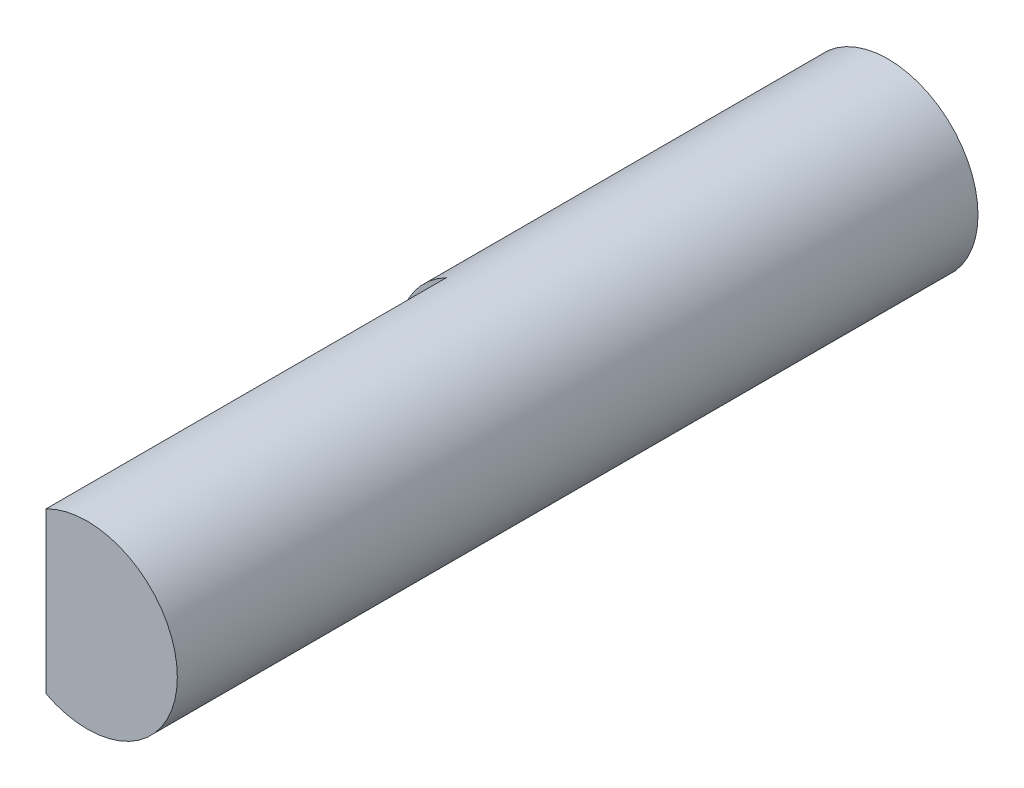
ISO-10303-21;
HEADER;
FILE_DESCRIPTION(('STEP AP214'),'2;1');
FILE_NAME('part.step','',(''),(''),'','','');
FILE_SCHEMA(('AUTOMOTIVE_DESIGN { 1 0 10303 214 1 1 1 1 }'));
ENDSEC;
DATA;
#1=APPLICATION_CONTEXT('core data for automotive mechanical design processes');
#2=APPLICATION_PROTOCOL_DEFINITION('international standard','automotive_design',2000,#1);
#3=PRODUCT_CONTEXT('',#1,'mechanical');
#4=PRODUCT('Part','Part','',(#3));
#5=PRODUCT_RELATED_PRODUCT_CATEGORY('part','',(#4));
#6=PRODUCT_DEFINITION_FORMATION('','',#4);
#7=PRODUCT_DEFINITION_CONTEXT('part definition',#1,'design');
#8=PRODUCT_DEFINITION('design','',#6,#7);
#9=PRODUCT_DEFINITION_SHAPE('','',#8);
#10=(LENGTH_UNIT() NAMED_UNIT(*) SI_UNIT(.MILLI.,.METRE.));
#11=(NAMED_UNIT(*) PLANE_ANGLE_UNIT() SI_UNIT($,.RADIAN.));
#12=(NAMED_UNIT(*) SI_UNIT($,.STERADIAN.) SOLID_ANGLE_UNIT());
#13=UNCERTAINTY_MEASURE_WITH_UNIT(LENGTH_MEASURE(1.E-05),#10,'distance_accuracy_value','');
#14=(GEOMETRIC_REPRESENTATION_CONTEXT(3) GLOBAL_UNCERTAINTY_ASSIGNED_CONTEXT((#13)) GLOBAL_UNIT_ASSIGNED_CONTEXT((#10,
#11,#12)) REPRESENTATION_CONTEXT('',''));
#15=CARTESIAN_POINT('',(0.,0.,0.));
#16=DIRECTION('',(0.,0.,1.));
#17=DIRECTION('',(1.,0.,0.));
#18=AXIS2_PLACEMENT_3D('',#15,#16,#17);
#19=CARTESIAN_POINT('',(-10.3077640640441,0.,150.));
#20=DIRECTION('',(1.,0.,0.));
#21=DIRECTION('',(0.,0.,-1.));
#22=AXIS2_PLACEMENT_3D('',#19,#20,#21);
#23=PLANE('',#22);
#24=DIRECTION('',(0.,0.,-1.));
#25=VECTOR('',#24,1.);
#26=CARTESIAN_POINT('',(-10.3077640640441,20.,150.));
#27=LINE('',#26,#25);
#28=CARTESIAN_POINT('',(-10.3077640640442,20.,200.));
#29=VERTEX_POINT('',#28);
#30=CARTESIAN_POINT('',(-10.3077640640441,20.,100.));
#31=VERTEX_POINT('',#30);
#32=EDGE_CURVE('E90',#29,#31,#27,.T.);
#33=ORIENTED_EDGE('',*,*,#32,.T.);
#34=DIRECTION('',(0.,-1.,0.));
#35=VECTOR('',#34,1.);
#36=CARTESIAN_POINT('',(-10.3077640640441,0.,100.));
#37=LINE('',#36,#35);
#38=CARTESIAN_POINT('',(-10.3077640640441,-20.,100.));
#39=VERTEX_POINT('',#38);
#40=EDGE_CURVE('E85',#31,#39,#37,.T.);
#41=ORIENTED_EDGE('',*,*,#40,.T.);
#42=DIRECTION('',(0.,0.,-1.));
#43=VECTOR('',#42,1.);
#44=CARTESIAN_POINT('',(-10.3077640640441,-20.,150.));
#45=LINE('',#44,#43);
#46=CARTESIAN_POINT('',(-10.3077640640442,-20.,200.));
#47=VERTEX_POINT('',#46);
#48=EDGE_CURVE('E104',#47,#39,#45,.T.);
#49=ORIENTED_EDGE('',*,*,#48,.F.);
#50=DIRECTION('',(0.,-1.,0.));
#51=VECTOR('',#50,1.);
#52=CARTESIAN_POINT('',(-10.3077640640441,0.,200.));
#53=LINE('',#52,#51);
#54=EDGE_CURVE('E108',#29,#47,#53,.T.);
#55=ORIENTED_EDGE('',*,*,#54,.F.);
#56=EDGE_LOOP('',(#33,#41,#49,#55));
#57=FACE_BOUND('',#56,.T.);
#58=ADVANCED_FACE('F44',(#57),#23,.F.);
#59=CARTESIAN_POINT('',(0.,0.,150.));
#60=DIRECTION('',(0.,0.,-1.));
#61=DIRECTION('',(-1.,0.,0.));
#62=AXIS2_PLACEMENT_3D('',#59,#60,#61);
#63=CYLINDRICAL_SURFACE('',#62,22.5);
#64=ORIENTED_EDGE('',*,*,#48,.T.);
#65=CARTESIAN_POINT('',(0.,0.,100.));
#66=DIRECTION('',(0.,0.,1.));
#67=DIRECTION('',(1.,0.,0.));
#68=AXIS2_PLACEMENT_3D('',#65,#66,#67);
#69=CIRCLE('',#68,22.5);
#70=EDGE_CURVE('E102',#31,#39,#69,.T.);
#71=ORIENTED_EDGE('',*,*,#70,.F.);
#72=ORIENTED_EDGE('',*,*,#32,.F.);
#73=CARTESIAN_POINT('',(0.,0.,200.));
#74=DIRECTION('',(0.,0.,1.));
#75=DIRECTION('',(1.,0.,0.));
#76=AXIS2_PLACEMENT_3D('',#73,#74,#75);
#77=CIRCLE('',#76,22.5);
#78=EDGE_CURVE('E100',#47,#29,#77,.T.);
#79=ORIENTED_EDGE('',*,*,#78,.F.);
#80=EDGE_LOOP('',(#64,#71,#72,#79));
#81=FACE_BOUND('',#80,.T.);
#82=CARTESIAN_POINT('',(0.,0.,0.));
#83=DIRECTION('',(0.,0.,1.));
#84=DIRECTION('',(1.,0.,0.));
#85=AXIS2_PLACEMENT_3D('',#82,#83,#84);
#86=CIRCLE('',#85,22.5);
#87=CARTESIAN_POINT('',(22.5,0.,0.));
#88=VERTEX_POINT('',#87);
#89=EDGE_CURVE('E105',#88,#88,#86,.T.);
#90=ORIENTED_EDGE('',*,*,#89,.T.);
#91=EDGE_LOOP('',(#90));
#92=FACE_BOUND('',#91,.T.);
#93=ADVANCED_FACE('F97',(#81,#92),#63,.T.);
#94=CARTESIAN_POINT('',(0.,0.,0.));
#95=DIRECTION('',(0.,0.,1.));
#96=DIRECTION('',(1.,0.,0.));
#97=AXIS2_PLACEMENT_3D('',#94,#95,#96);
#98=PLANE('',#97);
#99=ORIENTED_EDGE('',*,*,#89,.F.);
#100=EDGE_LOOP('',(#99));
#101=FACE_BOUND('',#100,.T.);
#102=ADVANCED_FACE('F165',(#101),#98,.F.);
#103=CARTESIAN_POINT('',(0.,0.,100.));
#104=DIRECTION('',(0.,0.,1.));
#105=DIRECTION('',(1.,0.,0.));
#106=AXIS2_PLACEMENT_3D('',#103,#104,#105);
#107=PLANE('',#106);
#108=ORIENTED_EDGE('',*,*,#40,.F.);
#109=ORIENTED_EDGE('',*,*,#70,.T.);
#110=EDGE_LOOP('',(#108,#109));
#111=FACE_BOUND('',#110,.T.);
#112=ADVANCED_FACE('F168',(#111),#107,.T.);
#113=CARTESIAN_POINT('',(0.,0.,200.));
#114=DIRECTION('',(0.,0.,1.));
#115=DIRECTION('',(1.,0.,0.));
#116=AXIS2_PLACEMENT_3D('',#113,#114,#115);
#117=PLANE('',#116);
#118=ORIENTED_EDGE('',*,*,#78,.T.);
#119=ORIENTED_EDGE('',*,*,#54,.T.);
#120=EDGE_LOOP('',(#118,#119));
#121=FACE_BOUND('',#120,.T.);
#122=ADVANCED_FACE('F112',(#121),#117,.T.);
#123=CLOSED_SHELL('',(#58,#93,#102,#112,#122));
#124=CARTESIAN_POINT('',(-8.80776406404415,0.,150.));
#125=DIRECTION('',(1.,0.,0.));
#126=DIRECTION('',(0.,0.,-1.));
#127=AXIS2_PLACEMENT_3D('',#124,#125,#126);
#128=PLANE('',#127);
#129=DIRECTION('',(0.,0.,-1.));
#130=VECTOR('',#129,1.);
#131=CARTESIAN_POINT('',(-8.80776406404415,19.0636641858834,198.5));
#132=LINE('',#131,#130);
#133=CARTESIAN_POINT('',(-8.80776406404415,19.0636641858834,198.5));
#134=VERTEX_POINT('',#133);
#135=CARTESIAN_POINT('',(-8.80776406404415,19.0636641858834,98.5));
#136=VERTEX_POINT('',#135);
#137=EDGE_CURVE('E48',#134,#136,#132,.T.);
#138=ORIENTED_EDGE('',*,*,#137,.F.);
#139=DIRECTION('',(0.,-1.,0.));
#140=VECTOR('',#139,1.);
#141=CARTESIAN_POINT('',(-8.80776406404415,0.,198.5));
#142=LINE('',#141,#140);
#143=CARTESIAN_POINT('',(-8.80776406404415,-19.0636641858834,198.5));
#144=VERTEX_POINT('',#143);
#145=EDGE_CURVE('E11',#134,#144,#142,.T.);
#146=ORIENTED_EDGE('',*,*,#145,.T.);
#147=DIRECTION('',(0.,0.,-1.));
#148=VECTOR('',#147,1.);
#149=CARTESIAN_POINT('',(-8.80776406404415,-19.0636641858834,198.5));
#150=LINE('',#149,#148);
#151=CARTESIAN_POINT('',(-8.80776406404415,-19.0636641858834,98.5));
#152=VERTEX_POINT('',#151);
#153=EDGE_CURVE('E134',#144,#152,#150,.T.);
#154=ORIENTED_EDGE('',*,*,#153,.T.);
#155=DIRECTION('',(0.,-1.,0.));
#156=VECTOR('',#155,1.);
#157=CARTESIAN_POINT('',(-8.80776406404415,0.,98.5));
#158=LINE('',#157,#156);
#159=EDGE_CURVE('E74',#136,#152,#158,.T.);
#160=ORIENTED_EDGE('',*,*,#159,.F.);
#161=EDGE_LOOP('',(#138,#146,#154,#160));
#162=FACE_BOUND('',#161,.T.);
#163=ADVANCED_FACE('F138',(#162),#128,.T.);
#164=CARTESIAN_POINT('',(0.,0.,150.));
#165=DIRECTION('',(0.,0.,-1.));
#166=DIRECTION('',(-1.,0.,0.));
#167=AXIS2_PLACEMENT_3D('',#164,#165,#166);
#168=CYLINDRICAL_SURFACE('',#167,21.);
#169=ORIENTED_EDGE('',*,*,#153,.F.);
#170=CARTESIAN_POINT('',(0.,0.,198.5));
#171=DIRECTION('',(0.,0.,1.));
#172=DIRECTION('',(1.,0.,0.));
#173=AXIS2_PLACEMENT_3D('',#170,#171,#172);
#174=CIRCLE('',#173,21.);
#175=EDGE_CURVE('E56',#144,#134,#174,.T.);
#176=ORIENTED_EDGE('',*,*,#175,.T.);
#177=ORIENTED_EDGE('',*,*,#137,.T.);
#178=CARTESIAN_POINT('',(0.,0.,98.5));
#179=DIRECTION('',(0.,0.,1.));
#180=DIRECTION('',(1.,0.,0.));
#181=AXIS2_PLACEMENT_3D('',#178,#179,#180);
#182=CIRCLE('',#181,21.);
#183=EDGE_CURVE('E127',#136,#152,#182,.T.);
#184=ORIENTED_EDGE('',*,*,#183,.T.);
#185=EDGE_LOOP('',(#169,#176,#177,#184));
#186=FACE_BOUND('',#185,.T.);
#187=CARTESIAN_POINT('',(0.,0.,1.5));
#188=DIRECTION('',(0.,0.,1.));
#189=DIRECTION('',(1.,0.,0.));
#190=AXIS2_PLACEMENT_3D('',#187,#188,#189);
#191=CIRCLE('',#190,21.);
#192=CARTESIAN_POINT('',(21.,0.,1.5));
#193=VERTEX_POINT('',#192);
#194=EDGE_CURVE('E130',#193,#193,#191,.T.);
#195=ORIENTED_EDGE('',*,*,#194,.F.);
#196=EDGE_LOOP('',(#195));
#197=FACE_BOUND('',#196,.T.);
#198=ADVANCED_FACE('F140',(#186,#197),#168,.F.);
#199=CARTESIAN_POINT('',(0.,0.,1.5));
#200=DIRECTION('',(0.,0.,1.));
#201=DIRECTION('',(1.,0.,0.));
#202=AXIS2_PLACEMENT_3D('',#199,#200,#201);
#203=PLANE('',#202);
#204=ORIENTED_EDGE('',*,*,#194,.T.);
#205=EDGE_LOOP('',(#204));
#206=FACE_BOUND('',#205,.T.);
#207=ADVANCED_FACE('F144',(#206),#203,.T.);
#208=CARTESIAN_POINT('',(0.,0.,98.5));
#209=DIRECTION('',(0.,0.,1.));
#210=DIRECTION('',(1.,0.,0.));
#211=AXIS2_PLACEMENT_3D('',#208,#209,#210);
#212=PLANE('',#211);
#213=ORIENTED_EDGE('',*,*,#159,.T.);
#214=ORIENTED_EDGE('',*,*,#183,.F.);
#215=EDGE_LOOP('',(#213,#214));
#216=FACE_BOUND('',#215,.T.);
#217=ADVANCED_FACE('F142',(#216),#212,.F.);
#218=CARTESIAN_POINT('',(0.,0.,198.5));
#219=DIRECTION('',(0.,0.,1.));
#220=DIRECTION('',(1.,0.,0.));
#221=AXIS2_PLACEMENT_3D('',#218,#219,#220);
#222=PLANE('',#221);
#223=ORIENTED_EDGE('',*,*,#175,.F.);
#224=ORIENTED_EDGE('',*,*,#145,.F.);
#225=EDGE_LOOP('',(#223,#224));
#226=FACE_BOUND('',#225,.T.);
#227=ADVANCED_FACE('F46',(#226),#222,.F.);
#228=CLOSED_SHELL('',(#163,#198,#207,#217,#227));
#229=ORIENTED_CLOSED_SHELL('',*,#228,.T.);
#230=BREP_WITH_VOIDS('B2',#123,(#229));
#231=ADVANCED_BREP_SHAPE_REPRESENTATION('',(#18,#230),#14);
#232=SHAPE_DEFINITION_REPRESENTATION(#9,#231);
ENDSEC;
END-ISO-10303-21;
